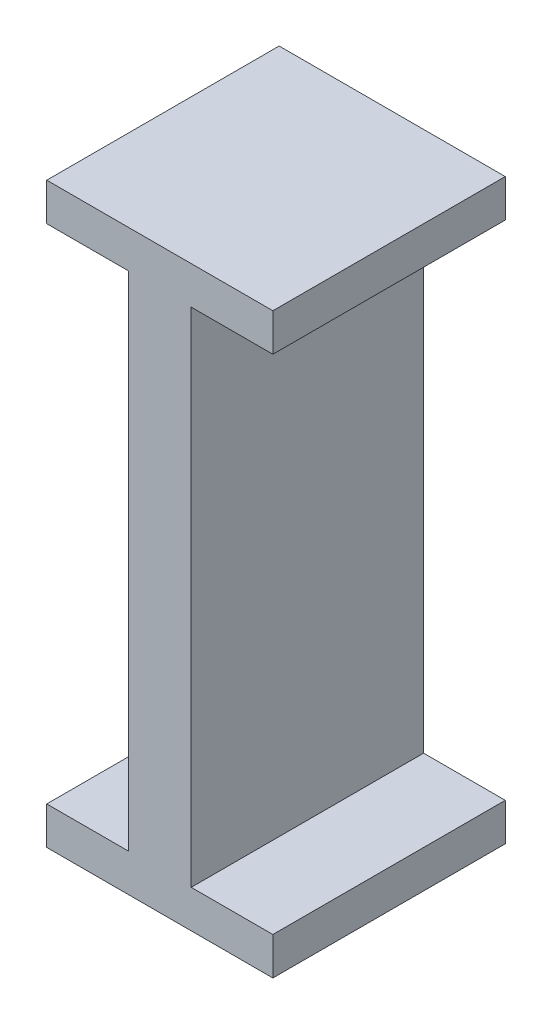
ISO-10303-21;
HEADER;
FILE_DESCRIPTION(('STEP AP214'),'2;1');
FILE_NAME('part.step','',(''),(''),'','','');
FILE_SCHEMA(('AUTOMOTIVE_DESIGN { 1 0 10303 214 1 1 1 1 }'));
ENDSEC;
DATA;
#1=APPLICATION_CONTEXT('core data for automotive mechanical design processes');
#2=APPLICATION_PROTOCOL_DEFINITION('international standard','automotive_design',2000,#1);
#3=PRODUCT_CONTEXT('',#1,'mechanical');
#4=PRODUCT('Part','Part','',(#3));
#5=PRODUCT_RELATED_PRODUCT_CATEGORY('part','',(#4));
#6=PRODUCT_DEFINITION_FORMATION('','',#4);
#7=PRODUCT_DEFINITION_CONTEXT('part definition',#1,'design');
#8=PRODUCT_DEFINITION('design','',#6,#7);
#9=PRODUCT_DEFINITION_SHAPE('','',#8);
#10=(LENGTH_UNIT() NAMED_UNIT(*) SI_UNIT(.MILLI.,.METRE.));
#11=(NAMED_UNIT(*) PLANE_ANGLE_UNIT() SI_UNIT($,.RADIAN.));
#12=(NAMED_UNIT(*) SI_UNIT($,.STERADIAN.) SOLID_ANGLE_UNIT());
#13=UNCERTAINTY_MEASURE_WITH_UNIT(LENGTH_MEASURE(1.E-05),#10,'distance_accuracy_value','');
#14=(GEOMETRIC_REPRESENTATION_CONTEXT(3) GLOBAL_UNCERTAINTY_ASSIGNED_CONTEXT((#13)) GLOBAL_UNIT_ASSIGNED_CONTEXT((#10,
#11,#12)) REPRESENTATION_CONTEXT('',''));
#15=CARTESIAN_POINT('',(0.,0.,0.));
#16=DIRECTION('',(0.,0.,1.));
#17=DIRECTION('',(1.,0.,0.));
#18=AXIS2_PLACEMENT_3D('',#15,#16,#17);
#19=CARTESIAN_POINT('',(0.,6.,0.));
#20=DIRECTION('',(0.,-1.,0.));
#21=DIRECTION('',(0.,0.,-1.));
#22=AXIS2_PLACEMENT_3D('',#19,#20,#21);
#23=PLANE('',#22);
#24=DIRECTION('',(0.,0.,1.));
#25=VECTOR('',#24,1.);
#26=CARTESIAN_POINT('',(-5.,6.,-18.5));
#27=LINE('',#26,#25);
#28=CARTESIAN_POINT('',(-5.,6.,-18.5));
#29=VERTEX_POINT('',#28);
#30=CARTESIAN_POINT('',(-5.,6.,18.5));
#31=VERTEX_POINT('',#30);
#32=EDGE_CURVE('E152',#29,#31,#27,.T.);
#33=ORIENTED_EDGE('',*,*,#32,.F.);
#34=DIRECTION('',(-1.,0.,0.));
#35=VECTOR('',#34,1.);
#36=CARTESIAN_POINT('',(-18.,6.,-18.5));
#37=LINE('',#36,#35);
#38=CARTESIAN_POINT('',(-18.,6.,-18.5));
#39=VERTEX_POINT('',#38);
#40=EDGE_CURVE('E247',#29,#39,#37,.T.);
#41=ORIENTED_EDGE('',*,*,#40,.T.);
#42=DIRECTION('',(0.,0.,1.));
#43=VECTOR('',#42,1.);
#44=CARTESIAN_POINT('',(-18.,6.,18.5));
#45=LINE('',#44,#43);
#46=CARTESIAN_POINT('',(-18.,6.,18.5));
#47=VERTEX_POINT('',#46);
#48=EDGE_CURVE('E222',#39,#47,#45,.T.);
#49=ORIENTED_EDGE('',*,*,#48,.T.);
#50=DIRECTION('',(1.,0.,0.));
#51=VECTOR('',#50,1.);
#52=CARTESIAN_POINT('',(-18.,6.,18.5));
#53=LINE('',#52,#51);
#54=EDGE_CURVE('E60',#47,#31,#53,.T.);
#55=ORIENTED_EDGE('',*,*,#54,.T.);
#56=EDGE_LOOP('',(#33,#41,#49,#55));
#57=FACE_BOUND('',#56,.T.);
#58=ADVANCED_FACE('F34',(#57),#23,.F.);
#59=DIRECTION('',(0.,0.,-1.));
#60=VECTOR('',#59,1.);
#61=CARTESIAN_POINT('',(5.,6.,-18.5));
#62=LINE('',#61,#60);
#63=CARTESIAN_POINT('',(5.,6.,18.5));
#64=VERTEX_POINT('',#63);
#65=CARTESIAN_POINT('',(5.,6.,-18.5));
#66=VERTEX_POINT('',#65);
#67=EDGE_CURVE('E52',#64,#66,#62,.T.);
#68=ORIENTED_EDGE('',*,*,#67,.F.);
#69=CARTESIAN_POINT('',(18.,6.,18.5));
#70=VERTEX_POINT('',#69);
#71=EDGE_CURVE('E219',#64,#70,#53,.T.);
#72=ORIENTED_EDGE('',*,*,#71,.T.);
#73=DIRECTION('',(0.,0.,-1.));
#74=VECTOR('',#73,1.);
#75=CARTESIAN_POINT('',(18.,6.,18.5));
#76=LINE('',#75,#74);
#77=CARTESIAN_POINT('',(18.,6.,-18.5));
#78=VERTEX_POINT('',#77);
#79=EDGE_CURVE('E237',#70,#78,#76,.T.);
#80=ORIENTED_EDGE('',*,*,#79,.T.);
#81=EDGE_CURVE('E246',#78,#66,#37,.T.);
#82=ORIENTED_EDGE('',*,*,#81,.T.);
#83=EDGE_LOOP('',(#68,#72,#80,#82));
#84=FACE_BOUND('',#83,.T.);
#85=ADVANCED_FACE('F284',(#84),#23,.F.);
#86=CARTESIAN_POINT('',(18.,6.,18.5));
#87=DIRECTION('',(-1.,0.,0.));
#88=DIRECTION('',(0.,0.,1.));
#89=AXIS2_PLACEMENT_3D('',#86,#87,#88);
#90=PLANE('',#89);
#91=DIRECTION('',(0.,0.,-1.));
#92=VECTOR('',#91,1.);
#93=CARTESIAN_POINT('',(18.,0.,18.5));
#94=LINE('',#93,#92);
#95=CARTESIAN_POINT('',(18.,0.,18.5));
#96=VERTEX_POINT('',#95);
#97=CARTESIAN_POINT('',(18.,0.,-18.5));
#98=VERTEX_POINT('',#97);
#99=EDGE_CURVE('E210',#96,#98,#94,.T.);
#100=ORIENTED_EDGE('',*,*,#99,.T.);
#101=DIRECTION('',(0.,-1.,0.));
#102=VECTOR('',#101,1.);
#103=CARTESIAN_POINT('',(18.,6.,-18.5));
#104=LINE('',#103,#102);
#105=EDGE_CURVE('E11',#78,#98,#104,.T.);
#106=ORIENTED_EDGE('',*,*,#105,.F.);
#107=ORIENTED_EDGE('',*,*,#79,.F.);
#108=DIRECTION('',(0.,-1.,0.));
#109=VECTOR('',#108,1.);
#110=CARTESIAN_POINT('',(18.,6.,18.5));
#111=LINE('',#110,#109);
#112=EDGE_CURVE('E238',#70,#96,#111,.T.);
#113=ORIENTED_EDGE('',*,*,#112,.T.);
#114=EDGE_LOOP('',(#100,#106,#107,#113));
#115=FACE_BOUND('',#114,.T.);
#116=ADVANCED_FACE('F36',(#115),#90,.F.);
#117=CARTESIAN_POINT('',(-18.,6.,-18.5));
#118=DIRECTION('',(0.,0.,1.));
#119=DIRECTION('',(1.,0.,0.));
#120=AXIS2_PLACEMENT_3D('',#117,#118,#119);
#121=PLANE('',#120);
#122=DIRECTION('',(-1.,0.,0.));
#123=VECTOR('',#122,1.);
#124=CARTESIAN_POINT('',(-18.,0.,-18.5));
#125=LINE('',#124,#123);
#126=CARTESIAN_POINT('',(-18.,0.,-18.5));
#127=VERTEX_POINT('',#126);
#128=EDGE_CURVE('E231',#98,#127,#125,.T.);
#129=ORIENTED_EDGE('',*,*,#128,.T.);
#130=DIRECTION('',(0.,-1.,0.));
#131=VECTOR('',#130,1.);
#132=CARTESIAN_POINT('',(-18.,6.,-18.5));
#133=LINE('',#132,#131);
#134=EDGE_CURVE('E44',#39,#127,#133,.T.);
#135=ORIENTED_EDGE('',*,*,#134,.F.);
#136=ORIENTED_EDGE('',*,*,#40,.F.);
#137=DIRECTION('',(0.,-1.,0.));
#138=VECTOR('',#137,1.);
#139=CARTESIAN_POINT('',(-5.,86.,-18.5));
#140=LINE('',#139,#138);
#141=CARTESIAN_POINT('',(-5.,86.,-18.5));
#142=VERTEX_POINT('',#141);
#143=EDGE_CURVE('E189',#142,#29,#140,.T.);
#144=ORIENTED_EDGE('',*,*,#143,.F.);
#145=DIRECTION('',(-1.,0.,0.));
#146=VECTOR('',#145,1.);
#147=CARTESIAN_POINT('',(-18.,86.,-18.5));
#148=LINE('',#147,#146);
#149=CARTESIAN_POINT('',(-18.,86.,-18.5));
#150=VERTEX_POINT('',#149);
#151=EDGE_CURVE('E163',#142,#150,#148,.T.);
#152=ORIENTED_EDGE('',*,*,#151,.T.);
#153=DIRECTION('',(0.,-1.,0.));
#154=VECTOR('',#153,1.);
#155=CARTESIAN_POINT('',(-18.,92.,-18.5));
#156=LINE('',#155,#154);
#157=CARTESIAN_POINT('',(-18.,92.,-18.5));
#158=VERTEX_POINT('',#157);
#159=EDGE_CURVE('E170',#158,#150,#156,.T.);
#160=ORIENTED_EDGE('',*,*,#159,.F.);
#161=DIRECTION('',(-1.,0.,0.));
#162=VECTOR('',#161,1.);
#163=CARTESIAN_POINT('',(-18.,92.,-18.5));
#164=LINE('',#163,#162);
#165=CARTESIAN_POINT('',(18.,92.,-18.5));
#166=VERTEX_POINT('',#165);
#167=EDGE_CURVE('E143',#166,#158,#164,.T.);
#168=ORIENTED_EDGE('',*,*,#167,.F.);
#169=DIRECTION('',(0.,-1.,0.));
#170=VECTOR('',#169,1.);
#171=CARTESIAN_POINT('',(18.,92.,-18.5));
#172=LINE('',#171,#170);
#173=CARTESIAN_POINT('',(18.,86.,-18.5));
#174=VERTEX_POINT('',#173);
#175=EDGE_CURVE('E156',#166,#174,#172,.T.);
#176=ORIENTED_EDGE('',*,*,#175,.T.);
#177=CARTESIAN_POINT('',(5.,86.,-18.5));
#178=VERTEX_POINT('',#177);
#179=EDGE_CURVE('E147',#174,#178,#148,.T.);
#180=ORIENTED_EDGE('',*,*,#179,.T.);
#181=DIRECTION('',(0.,-1.,0.));
#182=VECTOR('',#181,1.);
#183=CARTESIAN_POINT('',(5.,86.,-18.5));
#184=LINE('',#183,#182);
#185=EDGE_CURVE('E191',#178,#66,#184,.T.);
#186=ORIENTED_EDGE('',*,*,#185,.T.);
#187=ORIENTED_EDGE('',*,*,#81,.F.);
#188=ORIENTED_EDGE('',*,*,#105,.T.);
#189=EDGE_LOOP('',(#129,#135,#136,#144,#152,#160,#168,#176,#180,#186,#187,#188));
#190=FACE_BOUND('',#189,.T.);
#191=ADVANCED_FACE('F176',(#190),#121,.F.);
#192=CARTESIAN_POINT('',(-18.,6.,18.5));
#193=DIRECTION('',(1.,0.,0.));
#194=DIRECTION('',(0.,0.,-1.));
#195=AXIS2_PLACEMENT_3D('',#192,#193,#194);
#196=PLANE('',#195);
#197=DIRECTION('',(0.,0.,1.));
#198=VECTOR('',#197,1.);
#199=CARTESIAN_POINT('',(-18.,0.,18.5));
#200=LINE('',#199,#198);
#201=CARTESIAN_POINT('',(-18.,0.,18.5));
#202=VERTEX_POINT('',#201);
#203=EDGE_CURVE('E233',#127,#202,#200,.T.);
#204=ORIENTED_EDGE('',*,*,#203,.T.);
#205=DIRECTION('',(0.,-1.,0.));
#206=VECTOR('',#205,1.);
#207=CARTESIAN_POINT('',(-18.,6.,18.5));
#208=LINE('',#207,#206);
#209=EDGE_CURVE('E241',#47,#202,#208,.T.);
#210=ORIENTED_EDGE('',*,*,#209,.F.);
#211=ORIENTED_EDGE('',*,*,#48,.F.);
#212=ORIENTED_EDGE('',*,*,#134,.T.);
#213=EDGE_LOOP('',(#204,#210,#211,#212));
#214=FACE_BOUND('',#213,.T.);
#215=ADVANCED_FACE('F259',(#214),#196,.F.);
#216=CARTESIAN_POINT('',(-18.,6.,18.5));
#217=DIRECTION('',(0.,0.,-1.));
#218=DIRECTION('',(-1.,0.,0.));
#219=AXIS2_PLACEMENT_3D('',#216,#217,#218);
#220=PLANE('',#219);
#221=DIRECTION('',(1.,0.,0.));
#222=VECTOR('',#221,1.);
#223=CARTESIAN_POINT('',(-18.,0.,18.5));
#224=LINE('',#223,#222);
#225=EDGE_CURVE('E235',#202,#96,#224,.T.);
#226=ORIENTED_EDGE('',*,*,#225,.T.);
#227=ORIENTED_EDGE('',*,*,#112,.F.);
#228=ORIENTED_EDGE('',*,*,#71,.F.);
#229=DIRECTION('',(0.,-1.,0.));
#230=VECTOR('',#229,1.);
#231=CARTESIAN_POINT('',(5.,86.,18.5));
#232=LINE('',#231,#230);
#233=CARTESIAN_POINT('',(5.,86.,18.5));
#234=VERTEX_POINT('',#233);
#235=EDGE_CURVE('E211',#234,#64,#232,.T.);
#236=ORIENTED_EDGE('',*,*,#235,.F.);
#237=DIRECTION('',(1.,0.,0.));
#238=VECTOR('',#237,1.);
#239=CARTESIAN_POINT('',(-18.,86.,18.5));
#240=LINE('',#239,#238);
#241=CARTESIAN_POINT('',(18.,86.,18.5));
#242=VERTEX_POINT('',#241);
#243=EDGE_CURVE('E186',#234,#242,#240,.T.);
#244=ORIENTED_EDGE('',*,*,#243,.T.);
#245=DIRECTION('',(0.,-1.,0.));
#246=VECTOR('',#245,1.);
#247=CARTESIAN_POINT('',(18.,92.,18.5));
#248=LINE('',#247,#246);
#249=CARTESIAN_POINT('',(18.,92.,18.5));
#250=VERTEX_POINT('',#249);
#251=EDGE_CURVE('E134',#250,#242,#248,.T.);
#252=ORIENTED_EDGE('',*,*,#251,.F.);
#253=DIRECTION('',(1.,0.,0.));
#254=VECTOR('',#253,1.);
#255=CARTESIAN_POINT('',(-18.,92.,18.5));
#256=LINE('',#255,#254);
#257=CARTESIAN_POINT('',(-18.,92.,18.5));
#258=VERTEX_POINT('',#257);
#259=EDGE_CURVE('E126',#258,#250,#256,.T.);
#260=ORIENTED_EDGE('',*,*,#259,.F.);
#261=DIRECTION('',(0.,-1.,0.));
#262=VECTOR('',#261,1.);
#263=CARTESIAN_POINT('',(-18.,92.,18.5));
#264=LINE('',#263,#262);
#265=CARTESIAN_POINT('',(-18.,86.,18.5));
#266=VERTEX_POINT('',#265);
#267=EDGE_CURVE('E131',#258,#266,#264,.T.);
#268=ORIENTED_EDGE('',*,*,#267,.T.);
#269=CARTESIAN_POINT('',(-5.,86.,18.5));
#270=VERTEX_POINT('',#269);
#271=EDGE_CURVE('E261',#266,#270,#240,.T.);
#272=ORIENTED_EDGE('',*,*,#271,.T.);
#273=DIRECTION('',(0.,-1.,0.));
#274=VECTOR('',#273,1.);
#275=CARTESIAN_POINT('',(-5.,86.,18.5));
#276=LINE('',#275,#274);
#277=EDGE_CURVE('E208',#270,#31,#276,.T.);
#278=ORIENTED_EDGE('',*,*,#277,.T.);
#279=ORIENTED_EDGE('',*,*,#54,.F.);
#280=ORIENTED_EDGE('',*,*,#209,.T.);
#281=EDGE_LOOP('',(#226,#227,#228,#236,#244,#252,#260,#268,#272,#278,#279,#280));
#282=FACE_BOUND('',#281,.T.);
#283=ADVANCED_FACE('F128',(#282),#220,.F.);
#284=CARTESIAN_POINT('',(0.,0.,0.));
#285=DIRECTION('',(0.,-1.,0.));
#286=DIRECTION('',(0.,0.,-1.));
#287=AXIS2_PLACEMENT_3D('',#284,#285,#286);
#288=PLANE('',#287);
#289=ORIENTED_EDGE('',*,*,#99,.F.);
#290=ORIENTED_EDGE('',*,*,#225,.F.);
#291=ORIENTED_EDGE('',*,*,#203,.F.);
#292=ORIENTED_EDGE('',*,*,#128,.F.);
#293=EDGE_LOOP('',(#289,#290,#291,#292));
#294=FACE_BOUND('',#293,.T.);
#295=ADVANCED_FACE('F292',(#294),#288,.T.);
#296=CARTESIAN_POINT('',(-5.,86.,-18.5));
#297=DIRECTION('',(1.,0.,0.));
#298=DIRECTION('',(0.,0.,-1.));
#299=AXIS2_PLACEMENT_3D('',#296,#297,#298);
#300=PLANE('',#299);
#301=ORIENTED_EDGE('',*,*,#32,.T.);
#302=ORIENTED_EDGE('',*,*,#277,.F.);
#303=DIRECTION('',(0.,0.,1.));
#304=VECTOR('',#303,1.);
#305=CARTESIAN_POINT('',(-5.,86.,-18.5));
#306=LINE('',#305,#304);
#307=EDGE_CURVE('E38',#142,#270,#306,.T.);
#308=ORIENTED_EDGE('',*,*,#307,.F.);
#309=ORIENTED_EDGE('',*,*,#143,.T.);
#310=EDGE_LOOP('',(#301,#302,#308,#309));
#311=FACE_BOUND('',#310,.T.);
#312=ADVANCED_FACE('F264',(#311),#300,.F.);
#313=CARTESIAN_POINT('',(5.,86.,-18.5));
#314=DIRECTION('',(-1.,0.,0.));
#315=DIRECTION('',(0.,0.,1.));
#316=AXIS2_PLACEMENT_3D('',#313,#314,#315);
#317=PLANE('',#316);
#318=ORIENTED_EDGE('',*,*,#67,.T.);
#319=ORIENTED_EDGE('',*,*,#185,.F.);
#320=DIRECTION('',(0.,0.,-1.));
#321=VECTOR('',#320,1.);
#322=CARTESIAN_POINT('',(5.,86.,-18.5));
#323=LINE('',#322,#321);
#324=EDGE_CURVE('E185',#234,#178,#323,.T.);
#325=ORIENTED_EDGE('',*,*,#324,.F.);
#326=ORIENTED_EDGE('',*,*,#235,.T.);
#327=EDGE_LOOP('',(#318,#319,#325,#326));
#328=FACE_BOUND('',#327,.T.);
#329=ADVANCED_FACE('F308',(#328),#317,.F.);
#330=CARTESIAN_POINT('',(0.,86.,0.));
#331=DIRECTION('',(0.,1.,0.));
#332=DIRECTION('',(0.,0.,1.));
#333=AXIS2_PLACEMENT_3D('',#330,#331,#332);
#334=PLANE('',#333);
#335=ORIENTED_EDGE('',*,*,#151,.F.);
#336=ORIENTED_EDGE('',*,*,#307,.T.);
#337=ORIENTED_EDGE('',*,*,#271,.F.);
#338=DIRECTION('',(0.,0.,1.));
#339=VECTOR('',#338,1.);
#340=CARTESIAN_POINT('',(-18.,86.,-18.5));
#341=LINE('',#340,#339);
#342=EDGE_CURVE('E151',#150,#266,#341,.T.);
#343=ORIENTED_EDGE('',*,*,#342,.F.);
#344=EDGE_LOOP('',(#335,#336,#337,#343));
#345=FACE_BOUND('',#344,.T.);
#346=ADVANCED_FACE('F267',(#345),#334,.F.);
#347=ORIENTED_EDGE('',*,*,#243,.F.);
#348=ORIENTED_EDGE('',*,*,#324,.T.);
#349=ORIENTED_EDGE('',*,*,#179,.F.);
#350=DIRECTION('',(0.,0.,-1.));
#351=VECTOR('',#350,1.);
#352=CARTESIAN_POINT('',(18.,86.,-18.5));
#353=LINE('',#352,#351);
#354=EDGE_CURVE('E168',#242,#174,#353,.T.);
#355=ORIENTED_EDGE('',*,*,#354,.F.);
#356=EDGE_LOOP('',(#347,#348,#349,#355));
#357=FACE_BOUND('',#356,.T.);
#358=ADVANCED_FACE('F183',(#357),#334,.F.);
#359=CARTESIAN_POINT('',(-18.,92.,-18.5));
#360=DIRECTION('',(1.,0.,0.));
#361=DIRECTION('',(0.,0.,-1.));
#362=AXIS2_PLACEMENT_3D('',#359,#360,#361);
#363=PLANE('',#362);
#364=ORIENTED_EDGE('',*,*,#342,.T.);
#365=ORIENTED_EDGE('',*,*,#267,.F.);
#366=DIRECTION('',(0.,0.,1.));
#367=VECTOR('',#366,1.);
#368=CARTESIAN_POINT('',(-18.,92.,-18.5));
#369=LINE('',#368,#367);
#370=EDGE_CURVE('E138',#158,#258,#369,.T.);
#371=ORIENTED_EDGE('',*,*,#370,.F.);
#372=ORIENTED_EDGE('',*,*,#159,.T.);
#373=EDGE_LOOP('',(#364,#365,#371,#372));
#374=FACE_BOUND('',#373,.T.);
#375=ADVANCED_FACE('F149',(#374),#363,.F.);
#376=CARTESIAN_POINT('',(18.,92.,-18.5));
#377=DIRECTION('',(-1.,0.,0.));
#378=DIRECTION('',(0.,0.,1.));
#379=AXIS2_PLACEMENT_3D('',#376,#377,#378);
#380=PLANE('',#379);
#381=ORIENTED_EDGE('',*,*,#354,.T.);
#382=ORIENTED_EDGE('',*,*,#175,.F.);
#383=DIRECTION('',(0.,0.,-1.));
#384=VECTOR('',#383,1.);
#385=CARTESIAN_POINT('',(18.,92.,-18.5));
#386=LINE('',#385,#384);
#387=EDGE_CURVE('E137',#250,#166,#386,.T.);
#388=ORIENTED_EDGE('',*,*,#387,.F.);
#389=ORIENTED_EDGE('',*,*,#251,.T.);
#390=EDGE_LOOP('',(#381,#382,#388,#389));
#391=FACE_BOUND('',#390,.T.);
#392=ADVANCED_FACE('F273',(#391),#380,.F.);
#393=CARTESIAN_POINT('',(0.,92.,0.));
#394=DIRECTION('',(0.,1.,0.));
#395=DIRECTION('',(0.,0.,1.));
#396=AXIS2_PLACEMENT_3D('',#393,#394,#395);
#397=PLANE('',#396);
#398=ORIENTED_EDGE('',*,*,#370,.T.);
#399=ORIENTED_EDGE('',*,*,#259,.T.);
#400=ORIENTED_EDGE('',*,*,#387,.T.);
#401=ORIENTED_EDGE('',*,*,#167,.T.);
#402=EDGE_LOOP('',(#398,#399,#400,#401));
#403=FACE_BOUND('',#402,.T.);
#404=ADVANCED_FACE('F141',(#403),#397,.T.);
#405=CLOSED_SHELL('',(#58,#85,#116,#191,#215,#283,#295,#312,#329,#346,#358,#375,#392,#404));
#406=MANIFOLD_SOLID_BREP('B2',#405);
#407=ADVANCED_BREP_SHAPE_REPRESENTATION('',(#18,#406),#14);
#408=SHAPE_DEFINITION_REPRESENTATION(#9,#407);
ENDSEC;
END-ISO-10303-21;
